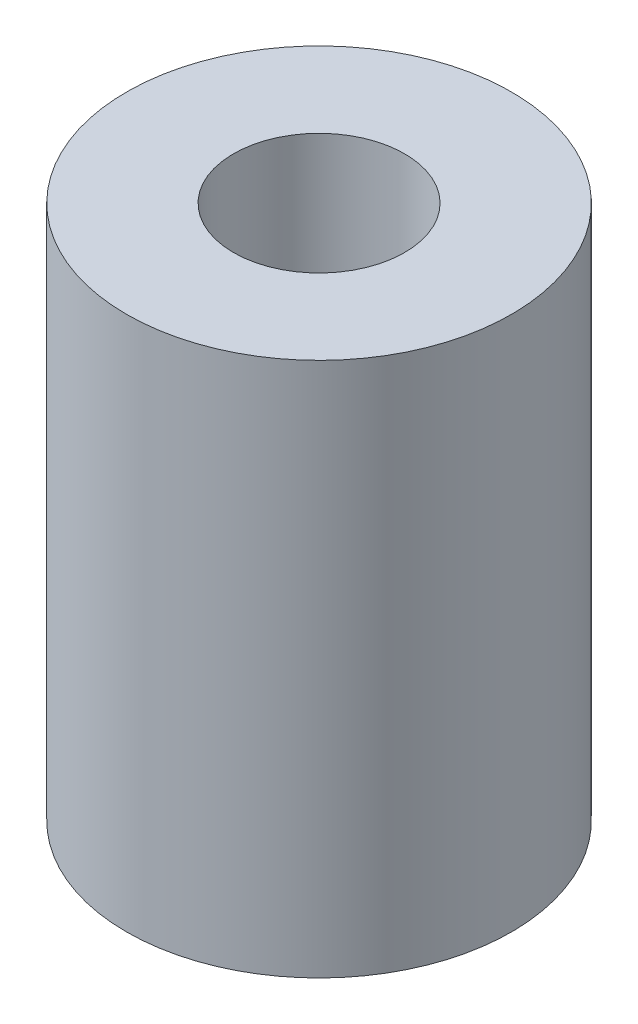
ISO-10303-21;
HEADER;
FILE_DESCRIPTION(('STEP AP214'),'2;1');
FILE_NAME('part.step','',(''),(''),'','','');
FILE_SCHEMA(('AUTOMOTIVE_DESIGN { 1 0 10303 214 1 1 1 1 }'));
ENDSEC;
DATA;
#1=APPLICATION_CONTEXT('core data for automotive mechanical design processes');
#2=APPLICATION_PROTOCOL_DEFINITION('international standard','automotive_design',2000,#1);
#3=PRODUCT_CONTEXT('',#1,'mechanical');
#4=PRODUCT('Part','Part','',(#3));
#5=PRODUCT_RELATED_PRODUCT_CATEGORY('part','',(#4));
#6=PRODUCT_DEFINITION_FORMATION('','',#4);
#7=PRODUCT_DEFINITION_CONTEXT('part definition',#1,'design');
#8=PRODUCT_DEFINITION('design','',#6,#7);
#9=PRODUCT_DEFINITION_SHAPE('','',#8);
#10=(LENGTH_UNIT() NAMED_UNIT(*) SI_UNIT(.MILLI.,.METRE.));
#11=(NAMED_UNIT(*) PLANE_ANGLE_UNIT() SI_UNIT($,.RADIAN.));
#12=(NAMED_UNIT(*) SI_UNIT($,.STERADIAN.) SOLID_ANGLE_UNIT());
#13=UNCERTAINTY_MEASURE_WITH_UNIT(LENGTH_MEASURE(1.E-05),#10,'distance_accuracy_value','');
#14=(GEOMETRIC_REPRESENTATION_CONTEXT(3) GLOBAL_UNCERTAINTY_ASSIGNED_CONTEXT((#13)) GLOBAL_UNIT_ASSIGNED_CONTEXT((#10,
#11,#12)) REPRESENTATION_CONTEXT('',''));
#15=CARTESIAN_POINT('',(0.,0.,0.));
#16=DIRECTION('',(0.,0.,1.));
#17=DIRECTION('',(1.,0.,0.));
#18=AXIS2_PLACEMENT_3D('',#15,#16,#17);
#19=CARTESIAN_POINT('',(0.,12.5,0.));
#20=DIRECTION('',(0.,-1.,0.));
#21=DIRECTION('',(0.,0.,-1.));
#22=AXIS2_PLACEMENT_3D('',#19,#20,#21);
#23=CYLINDRICAL_SURFACE('',#22,9.);
#24=CARTESIAN_POINT('',(0.,12.5,0.));
#25=DIRECTION('',(0.,1.,0.));
#26=DIRECTION('',(0.,0.,1.));
#27=AXIS2_PLACEMENT_3D('',#24,#25,#26);
#28=CIRCLE('',#27,9.);
#29=CARTESIAN_POINT('',(0.,12.5,9.));
#30=VERTEX_POINT('',#29);
#31=EDGE_CURVE('E10',#30,#30,#28,.T.);
#32=ORIENTED_EDGE('',*,*,#31,.F.);
#33=EDGE_LOOP('',(#32));
#34=FACE_BOUND('',#33,.T.);
#35=CARTESIAN_POINT('',(0.,-12.5,0.));
#36=DIRECTION('',(0.,1.,0.));
#37=DIRECTION('',(0.,0.,1.));
#38=AXIS2_PLACEMENT_3D('',#35,#36,#37);
#39=CIRCLE('',#38,9.);
#40=CARTESIAN_POINT('',(0.,-12.5,9.));
#41=VERTEX_POINT('',#40);
#42=EDGE_CURVE('E34',#41,#41,#39,.T.);
#43=ORIENTED_EDGE('',*,*,#42,.T.);
#44=EDGE_LOOP('',(#43));
#45=FACE_BOUND('',#44,.T.);
#46=ADVANCED_FACE('F31',(#34,#45),#23,.T.);
#47=CARTESIAN_POINT('',(0.,12.5,0.));
#48=DIRECTION('',(0.,1.,0.));
#49=DIRECTION('',(0.,0.,1.));
#50=AXIS2_PLACEMENT_3D('',#47,#48,#49);
#51=PLANE('',#50);
#52=CARTESIAN_POINT('',(0.,12.5,0.));
#53=DIRECTION('',(0.,1.,0.));
#54=DIRECTION('',(0.,0.,1.));
#55=AXIS2_PLACEMENT_3D('',#52,#53,#54);
#56=CIRCLE('',#55,4.);
#57=CARTESIAN_POINT('',(0.,12.5,4.));
#58=VERTEX_POINT('',#57);
#59=EDGE_CURVE('E45',#58,#58,#56,.T.);
#60=ORIENTED_EDGE('',*,*,#59,.F.);
#61=EDGE_LOOP('',(#60));
#62=FACE_BOUND('',#61,.T.);
#63=ORIENTED_EDGE('',*,*,#31,.T.);
#64=EDGE_LOOP('',(#63));
#65=FACE_BOUND('',#64,.T.);
#66=ADVANCED_FACE('F62',(#62,#65),#51,.T.);
#67=CARTESIAN_POINT('',(0.,-12.5,0.));
#68=DIRECTION('',(0.,1.,0.));
#69=DIRECTION('',(0.,0.,1.));
#70=AXIS2_PLACEMENT_3D('',#67,#68,#69);
#71=PLANE('',#70);
#72=CARTESIAN_POINT('',(0.,-12.5,0.));
#73=DIRECTION('',(0.,-1.,0.));
#74=DIRECTION('',(0.,0.,-1.));
#75=AXIS2_PLACEMENT_3D('',#72,#73,#74);
#76=CIRCLE('',#75,2.5);
#77=CARTESIAN_POINT('',(0.,-12.5,-2.5));
#78=VERTEX_POINT('',#77);
#79=EDGE_CURVE('E51',#78,#78,#76,.T.);
#80=ORIENTED_EDGE('',*,*,#79,.F.);
#81=EDGE_LOOP('',(#80));
#82=FACE_BOUND('',#81,.T.);
#83=ORIENTED_EDGE('',*,*,#42,.F.);
#84=EDGE_LOOP('',(#83));
#85=FACE_BOUND('',#84,.T.);
#86=ADVANCED_FACE('F58',(#82,#85),#71,.F.);
#87=CARTESIAN_POINT('',(0.,-11.3137084989848,0.));
#88=DIRECTION('',(0.,1.,0.));
#89=DIRECTION('',(0.,0.,1.));
#90=AXIS2_PLACEMENT_3D('',#87,#88,#89);
#91=CYLINDRICAL_SURFACE('',#90,4.);
#92=CARTESIAN_POINT('',(0.,0.,0.));
#93=DIRECTION('',(0.,1.,0.));
#94=DIRECTION('',(0.,0.,1.));
#95=AXIS2_PLACEMENT_3D('',#92,#93,#94);
#96=CIRCLE('',#95,4.);
#97=CARTESIAN_POINT('',(0.,0.,4.));
#98=VERTEX_POINT('',#97);
#99=EDGE_CURVE('E41',#98,#98,#96,.F.);
#100=ORIENTED_EDGE('',*,*,#99,.T.);
#101=EDGE_LOOP('',(#100));
#102=FACE_BOUND('',#101,.T.);
#103=ORIENTED_EDGE('',*,*,#59,.T.);
#104=EDGE_LOOP('',(#103));
#105=FACE_BOUND('',#104,.T.);
#106=ADVANCED_FACE('F61',(#102,#105),#91,.F.);
#107=CARTESIAN_POINT('',(0.,0.,0.));
#108=DIRECTION('',(0.,1.,0.));
#109=DIRECTION('',(0.,0.,1.));
#110=AXIS2_PLACEMENT_3D('',#107,#108,#109);
#111=PLANE('',#110);
#112=CARTESIAN_POINT('',(0.,0.,0.));
#113=DIRECTION('',(0.,1.,0.));
#114=DIRECTION('',(0.,0.,1.));
#115=AXIS2_PLACEMENT_3D('',#112,#113,#114);
#116=CIRCLE('',#115,2.5);
#117=CARTESIAN_POINT('',(0.,0.,2.5));
#118=VERTEX_POINT('',#117);
#119=EDGE_CURVE('E48',#118,#118,#116,.F.);
#120=ORIENTED_EDGE('',*,*,#119,.T.);
#121=EDGE_LOOP('',(#120));
#122=FACE_BOUND('',#121,.T.);
#123=ORIENTED_EDGE('',*,*,#99,.F.);
#124=EDGE_LOOP('',(#123));
#125=FACE_BOUND('',#124,.T.);
#126=ADVANCED_FACE('F78',(#122,#125),#111,.T.);
#127=CARTESIAN_POINT('',(0.,7.07106781186548,0.));
#128=DIRECTION('',(0.,-1.,0.));
#129=DIRECTION('',(0.,0.,-1.));
#130=AXIS2_PLACEMENT_3D('',#127,#128,#129);
#131=CYLINDRICAL_SURFACE('',#130,2.5);
#132=ORIENTED_EDGE('',*,*,#79,.T.);
#133=EDGE_LOOP('',(#132));
#134=FACE_BOUND('',#133,.T.);
#135=ORIENTED_EDGE('',*,*,#119,.F.);
#136=EDGE_LOOP('',(#135));
#137=FACE_BOUND('',#136,.T.);
#138=ADVANCED_FACE('F55',(#134,#137),#131,.F.);
#139=CLOSED_SHELL('',(#46,#66,#86,#106,#126,#138));
#140=MANIFOLD_SOLID_BREP('B2',#139);
#141=ADVANCED_BREP_SHAPE_REPRESENTATION('',(#18,#140),#14);
#142=SHAPE_DEFINITION_REPRESENTATION(#9,#141);
ENDSEC;
END-ISO-10303-21;
